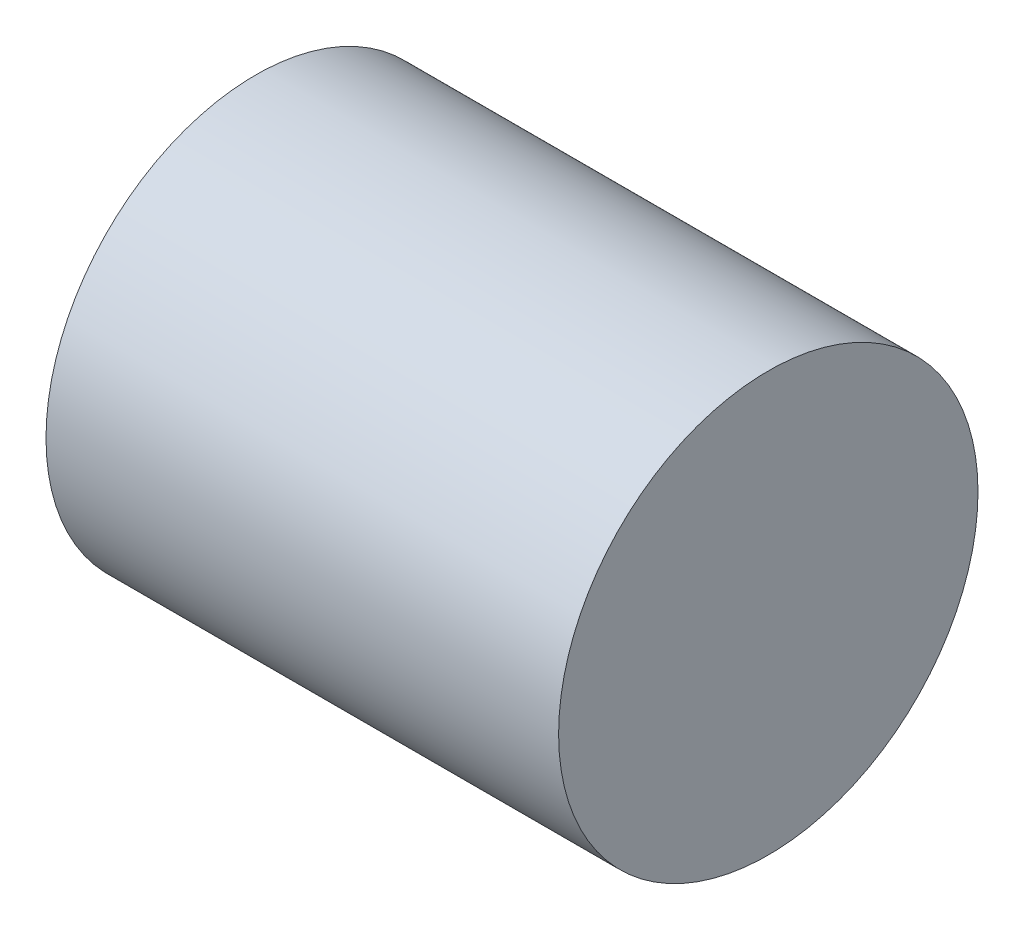
ISO-10303-21;
HEADER;
FILE_DESCRIPTION(('STEP AP214'),'2;1');
FILE_NAME('part.step','',(''),(''),'','','');
FILE_SCHEMA(('AUTOMOTIVE_DESIGN { 1 0 10303 214 1 1 1 1 }'));
ENDSEC;
DATA;
#1=APPLICATION_CONTEXT('core data for automotive mechanical design processes');
#2=APPLICATION_PROTOCOL_DEFINITION('international standard','automotive_design',2000,#1);
#3=PRODUCT_CONTEXT('',#1,'mechanical');
#4=PRODUCT('Part','Part','',(#3));
#5=PRODUCT_RELATED_PRODUCT_CATEGORY('part','',(#4));
#6=PRODUCT_DEFINITION_FORMATION('','',#4);
#7=PRODUCT_DEFINITION_CONTEXT('part definition',#1,'design');
#8=PRODUCT_DEFINITION('design','',#6,#7);
#9=PRODUCT_DEFINITION_SHAPE('','',#8);
#10=(LENGTH_UNIT() NAMED_UNIT(*) SI_UNIT(.MILLI.,.METRE.));
#11=(NAMED_UNIT(*) PLANE_ANGLE_UNIT() SI_UNIT($,.RADIAN.));
#12=(NAMED_UNIT(*) SI_UNIT($,.STERADIAN.) SOLID_ANGLE_UNIT());
#13=UNCERTAINTY_MEASURE_WITH_UNIT(LENGTH_MEASURE(1.E-05),#10,'distance_accuracy_value','');
#14=(GEOMETRIC_REPRESENTATION_CONTEXT(3) GLOBAL_UNCERTAINTY_ASSIGNED_CONTEXT((#13)) GLOBAL_UNIT_ASSIGNED_CONTEXT((#10,
#11,#12)) REPRESENTATION_CONTEXT('',''));
#15=CARTESIAN_POINT('',(0.,0.,0.));
#16=DIRECTION('',(0.,0.,1.));
#17=DIRECTION('',(1.,0.,0.));
#18=AXIS2_PLACEMENT_3D('',#15,#16,#17);
#19=CARTESIAN_POINT('',(11.,27.6228740357971,48.2888760922083));
#20=DIRECTION('',(-1.,0.,0.));
#21=DIRECTION('',(0.,0.,1.));
#22=AXIS2_PLACEMENT_3D('',#19,#20,#21);
#23=CYLINDRICAL_SURFACE('',#22,4.5);
#24=CARTESIAN_POINT('',(11.,27.6228740357971,48.2888760922083));
#25=DIRECTION('',(1.,0.,0.));
#26=DIRECTION('',(0.,0.,-1.));
#27=AXIS2_PLACEMENT_3D('',#24,#25,#26);
#28=CIRCLE('',#27,4.5);
#29=CARTESIAN_POINT('',(11.,27.6228740357971,43.7888760922083));
#30=VERTEX_POINT('',#29);
#31=EDGE_CURVE('E10',#30,#30,#28,.T.);
#32=ORIENTED_EDGE('',*,*,#31,.F.);
#33=EDGE_LOOP('',(#32));
#34=FACE_BOUND('',#33,.T.);
#35=CARTESIAN_POINT('',(0.,27.6228740357971,48.2888760922083));
#36=DIRECTION('',(1.,0.,0.));
#37=DIRECTION('',(0.,0.,-1.));
#38=AXIS2_PLACEMENT_3D('',#35,#36,#37);
#39=CIRCLE('',#38,4.5);
#40=CARTESIAN_POINT('',(0.,27.6228740357971,43.7888760922083));
#41=VERTEX_POINT('',#40);
#42=EDGE_CURVE('E40',#41,#41,#39,.T.);
#43=ORIENTED_EDGE('',*,*,#42,.T.);
#44=EDGE_LOOP('',(#43));
#45=FACE_BOUND('',#44,.T.);
#46=ADVANCED_FACE('F37',(#34,#45),#23,.T.);
#47=CARTESIAN_POINT('',(11.,27.6228740357971,48.2888760922083));
#48=DIRECTION('',(1.,0.,0.));
#49=DIRECTION('',(0.,0.,-1.));
#50=AXIS2_PLACEMENT_3D('',#47,#48,#49);
#51=PLANE('',#50);
#52=ORIENTED_EDGE('',*,*,#31,.T.);
#53=EDGE_LOOP('',(#52));
#54=FACE_BOUND('',#53,.T.);
#55=ADVANCED_FACE('F54',(#54),#51,.T.);
#56=CARTESIAN_POINT('',(0.,27.6228740357971,48.2888760922083));
#57=DIRECTION('',(1.,0.,0.));
#58=DIRECTION('',(0.,0.,-1.));
#59=AXIS2_PLACEMENT_3D('',#56,#57,#58);
#60=PLANE('',#59);
#61=ORIENTED_EDGE('',*,*,#42,.F.);
#62=EDGE_LOOP('',(#61));
#63=FACE_BOUND('',#62,.T.);
#64=ADVANCED_FACE('F52',(#63),#60,.F.);
#65=CLOSED_SHELL('',(#46,#55,#64));
#66=MANIFOLD_SOLID_BREP('B2',#65);
#67=ADVANCED_BREP_SHAPE_REPRESENTATION('',(#18,#66),#14);
#68=SHAPE_DEFINITION_REPRESENTATION(#9,#67);
ENDSEC;
END-ISO-10303-21;
